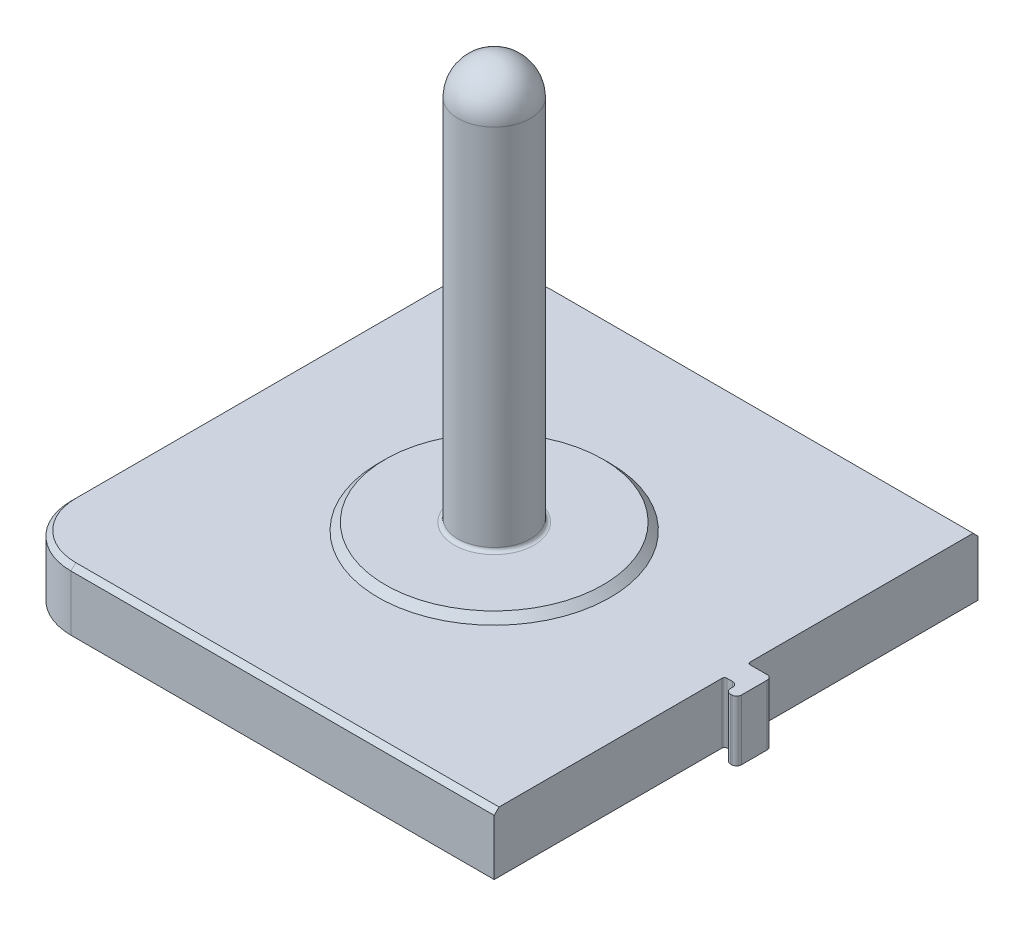
ISO-10303-21;
HEADER;
FILE_DESCRIPTION(('STEP AP214'),'2;1');
FILE_NAME('part.step','',(''),(''),'','','');
FILE_SCHEMA(('AUTOMOTIVE_DESIGN { 1 0 10303 214 1 1 1 1 }'));
ENDSEC;
DATA;
#1=APPLICATION_CONTEXT('core data for automotive mechanical design processes');
#2=APPLICATION_PROTOCOL_DEFINITION('international standard','automotive_design',2000,#1);
#3=PRODUCT_CONTEXT('',#1,'mechanical');
#4=PRODUCT('Part','Part','',(#3));
#5=PRODUCT_RELATED_PRODUCT_CATEGORY('part','',(#4));
#6=PRODUCT_DEFINITION_FORMATION('','',#4);
#7=PRODUCT_DEFINITION_CONTEXT('part definition',#1,'design');
#8=PRODUCT_DEFINITION('design','',#6,#7);
#9=PRODUCT_DEFINITION_SHAPE('','',#8);
#10=(LENGTH_UNIT() NAMED_UNIT(*) SI_UNIT(.MILLI.,.METRE.));
#11=(NAMED_UNIT(*) PLANE_ANGLE_UNIT() SI_UNIT($,.RADIAN.));
#12=(NAMED_UNIT(*) SI_UNIT($,.STERADIAN.) SOLID_ANGLE_UNIT());
#13=UNCERTAINTY_MEASURE_WITH_UNIT(LENGTH_MEASURE(1.E-05),#10,'distance_accuracy_value','');
#14=(GEOMETRIC_REPRESENTATION_CONTEXT(3) GLOBAL_UNCERTAINTY_ASSIGNED_CONTEXT((#13)) GLOBAL_UNIT_ASSIGNED_CONTEXT((#10,
#11,#12)) REPRESENTATION_CONTEXT('',''));
#15=CARTESIAN_POINT('',(0.,0.,0.));
#16=DIRECTION('',(0.,0.,1.));
#17=DIRECTION('',(1.,0.,0.));
#18=AXIS2_PLACEMENT_3D('',#15,#16,#17);
#19=CARTESIAN_POINT('',(100.,25.,99.9999999999999));
#20=DIRECTION('',(-1.,0.,0.));
#21=DIRECTION('',(0.,0.,1.));
#22=AXIS2_PLACEMENT_3D('',#19,#20,#21);
#23=PLANE('',#22);
#24=DIRECTION('',(0.,0.,-1.));
#25=VECTOR('',#24,1.);
#26=CARTESIAN_POINT('',(100.,25.,99.9999999999999));
#27=LINE('',#26,#25);
#28=CARTESIAN_POINT('',(100.,25.,98.));
#29=VERTEX_POINT('',#28);
#30=CARTESIAN_POINT('',(100.,25.,5.80000000000003));
#31=VERTEX_POINT('',#30);
#32=EDGE_CURVE('E260',#29,#31,#27,.T.);
#33=ORIENTED_EDGE('',*,*,#32,.F.);
#34=DIRECTION('',(0.,-0.707106781186551,0.707106781186544));
#35=VECTOR('',#34,1.);
#36=CARTESIAN_POINT('',(100.,25.,98.));
#37=LINE('',#36,#35);
#38=CARTESIAN_POINT('',(100.,23.,99.9999999999999));
#39=VERTEX_POINT('',#38);
#40=EDGE_CURVE('E45',#29,#39,#37,.T.);
#41=ORIENTED_EDGE('',*,*,#40,.T.);
#42=DIRECTION('',(0.,-1.,0.));
#43=VECTOR('',#42,1.);
#44=CARTESIAN_POINT('',(100.,25.,99.9999999999999));
#45=LINE('',#44,#43);
#46=CARTESIAN_POINT('',(100.,0.,99.9999999999999));
#47=VERTEX_POINT('',#46);
#48=EDGE_CURVE('E277',#39,#47,#45,.T.);
#49=ORIENTED_EDGE('',*,*,#48,.T.);
#50=DIRECTION('',(0.,0.,-1.));
#51=VECTOR('',#50,1.);
#52=CARTESIAN_POINT('',(100.,0.,99.9999999999999));
#53=LINE('',#52,#51);
#54=CARTESIAN_POINT('',(100.,0.,5.80000000000003));
#55=VERTEX_POINT('',#54);
#56=EDGE_CURVE('E270',#47,#55,#53,.T.);
#57=ORIENTED_EDGE('',*,*,#56,.T.);
#58=DIRECTION('',(0.,-1.,0.));
#59=VECTOR('',#58,1.);
#60=CARTESIAN_POINT('',(100.,25.,5.8));
#61=LINE('',#60,#59);
#62=EDGE_CURVE('E286',#55,#31,#61,.F.);
#63=ORIENTED_EDGE('',*,*,#62,.T.);
#64=EDGE_LOOP('',(#33,#41,#49,#57,#63));
#65=FACE_BOUND('',#64,.T.);
#66=ADVANCED_FACE('F35',(#65),#23,.F.);
#67=CARTESIAN_POINT('',(-100.,25.,100.));
#68=DIRECTION('',(1.,0.,0.));
#69=DIRECTION('',(0.,0.,-1.));
#70=AXIS2_PLACEMENT_3D('',#67,#68,#69);
#71=PLANE('',#70);
#72=DIRECTION('',(0.,-1.,0.));
#73=VECTOR('',#72,1.);
#74=CARTESIAN_POINT('',(-100.,25.,75.));
#75=LINE('',#74,#73);
#76=CARTESIAN_POINT('',(-100.,0.,75.));
#77=VERTEX_POINT('',#76);
#78=CARTESIAN_POINT('',(-100.,23.,75.));
#79=VERTEX_POINT('',#78);
#80=EDGE_CURVE('E296',#77,#79,#75,.F.);
#81=ORIENTED_EDGE('',*,*,#80,.T.);
#82=DIRECTION('',(0.,0.,-1.));
#83=VECTOR('',#82,1.);
#84=CARTESIAN_POINT('',(-100.,23.,-75.));
#85=LINE('',#84,#83);
#86=CARTESIAN_POINT('',(-100.,23.,-75.));
#87=VERTEX_POINT('',#86);
#88=EDGE_CURVE('E339',#79,#87,#85,.T.);
#89=ORIENTED_EDGE('',*,*,#88,.T.);
#90=DIRECTION('',(0.,-1.,0.));
#91=VECTOR('',#90,1.);
#92=CARTESIAN_POINT('',(-100.,25.,-75.));
#93=LINE('',#92,#91);
#94=CARTESIAN_POINT('',(-100.,0.,-75.));
#95=VERTEX_POINT('',#94);
#96=EDGE_CURVE('E299',#87,#95,#93,.T.);
#97=ORIENTED_EDGE('',*,*,#96,.T.);
#98=DIRECTION('',(0.,0.,1.));
#99=VECTOR('',#98,1.);
#100=CARTESIAN_POINT('',(-100.,0.,100.));
#101=LINE('',#100,#99);
#102=EDGE_CURVE('E199',#95,#77,#101,.T.);
#103=ORIENTED_EDGE('',*,*,#102,.T.);
#104=EDGE_LOOP('',(#81,#89,#97,#103));
#105=FACE_BOUND('',#104,.T.);
#106=ADVANCED_FACE('F383',(#105),#71,.F.);
#107=CARTESIAN_POINT('',(100.,25.,99.9999999999999));
#108=DIRECTION('',(0.,0.,-1.));
#109=DIRECTION('',(-1.,0.,0.));
#110=AXIS2_PLACEMENT_3D('',#107,#108,#109);
#111=PLANE('',#110);
#112=ORIENTED_EDGE('',*,*,#48,.F.);
#113=DIRECTION('',(-1.,0.,0.));
#114=VECTOR('',#113,1.);
#115=CARTESIAN_POINT('',(-75.,23.,100.));
#116=LINE('',#115,#114);
#117=CARTESIAN_POINT('',(-75.,23.,100.));
#118=VERTEX_POINT('',#117);
#119=EDGE_CURVE('E11',#39,#118,#116,.T.);
#120=ORIENTED_EDGE('',*,*,#119,.T.);
#121=DIRECTION('',(0.,-1.,0.));
#122=VECTOR('',#121,1.);
#123=CARTESIAN_POINT('',(-75.,25.,100.));
#124=LINE('',#123,#122);
#125=CARTESIAN_POINT('',(-75.,0.,100.));
#126=VERTEX_POINT('',#125);
#127=EDGE_CURVE('E308',#118,#126,#124,.T.);
#128=ORIENTED_EDGE('',*,*,#127,.T.);
#129=DIRECTION('',(1.,0.,0.));
#130=VECTOR('',#129,1.);
#131=CARTESIAN_POINT('',(100.,0.,99.9999999999999));
#132=LINE('',#131,#130);
#133=EDGE_CURVE('E266',#126,#47,#132,.T.);
#134=ORIENTED_EDGE('',*,*,#133,.T.);
#135=EDGE_LOOP('',(#112,#120,#128,#134));
#136=FACE_BOUND('',#135,.T.);
#137=ADVANCED_FACE('F389',(#136),#111,.F.);
#138=DIRECTION('',(0.,-1.,0.));
#139=VECTOR('',#138,1.);
#140=CARTESIAN_POINT('',(100.,25.,-100.));
#141=LINE('',#140,#139);
#142=CARTESIAN_POINT('',(100.,23.,-100.));
#143=VERTEX_POINT('',#142);
#144=CARTESIAN_POINT('',(100.,0.,-100.));
#145=VERTEX_POINT('',#144);
#146=EDGE_CURVE('E262',#143,#145,#141,.T.);
#147=ORIENTED_EDGE('',*,*,#146,.F.);
#148=DIRECTION('',(0.,0.707106781186554,0.707106781186541));
#149=VECTOR('',#148,1.);
#150=CARTESIAN_POINT('',(100.,25.,-98.0000000000001));
#151=LINE('',#150,#149);
#152=CARTESIAN_POINT('',(100.,25.,-98.));
#153=VERTEX_POINT('',#152);
#154=EDGE_CURVE('E335',#143,#153,#151,.T.);
#155=ORIENTED_EDGE('',*,*,#154,.T.);
#156=CARTESIAN_POINT('',(100.,25.,-5.79999999999997));
#157=VERTEX_POINT('',#156);
#158=EDGE_CURVE('E263',#157,#153,#27,.T.);
#159=ORIENTED_EDGE('',*,*,#158,.F.);
#160=DIRECTION('',(0.,-1.,0.));
#161=VECTOR('',#160,1.);
#162=CARTESIAN_POINT('',(100.,0.,-5.8));
#163=LINE('',#162,#161);
#164=CARTESIAN_POINT('',(100.,0.,-5.79999999999997));
#165=VERTEX_POINT('',#164);
#166=EDGE_CURVE('E279',#157,#165,#163,.T.);
#167=ORIENTED_EDGE('',*,*,#166,.T.);
#168=EDGE_CURVE('E269',#165,#145,#53,.T.);
#169=ORIENTED_EDGE('',*,*,#168,.T.);
#170=EDGE_LOOP('',(#147,#155,#159,#167,#169));
#171=FACE_BOUND('',#170,.T.);
#172=ADVANCED_FACE('F385',(#171),#23,.F.);
#173=CARTESIAN_POINT('',(100.,25.,-100.));
#174=DIRECTION('',(0.,0.,1.));
#175=DIRECTION('',(1.,0.,0.));
#176=AXIS2_PLACEMENT_3D('',#173,#174,#175);
#177=PLANE('',#176);
#178=DIRECTION('',(0.,-1.,0.));
#179=VECTOR('',#178,1.);
#180=CARTESIAN_POINT('',(-75.,25.,-100.));
#181=LINE('',#180,#179);
#182=CARTESIAN_POINT('',(-75.,0.,-100.));
#183=VERTEX_POINT('',#182);
#184=CARTESIAN_POINT('',(-75.,23.,-100.));
#185=VERTEX_POINT('',#184);
#186=EDGE_CURVE('E305',#183,#185,#181,.F.);
#187=ORIENTED_EDGE('',*,*,#186,.T.);
#188=DIRECTION('',(1.,0.,0.));
#189=VECTOR('',#188,1.);
#190=CARTESIAN_POINT('',(100.,23.,-100.));
#191=LINE('',#190,#189);
#192=EDGE_CURVE('E333',#185,#143,#191,.T.);
#193=ORIENTED_EDGE('',*,*,#192,.T.);
#194=ORIENTED_EDGE('',*,*,#146,.T.);
#195=DIRECTION('',(-1.,0.,0.));
#196=VECTOR('',#195,1.);
#197=CARTESIAN_POINT('',(100.,0.,-100.));
#198=LINE('',#197,#196);
#199=EDGE_CURVE('E273',#145,#183,#198,.T.);
#200=ORIENTED_EDGE('',*,*,#199,.T.);
#201=EDGE_LOOP('',(#187,#193,#194,#200));
#202=FACE_BOUND('',#201,.T.);
#203=ADVANCED_FACE('F395',(#202),#177,.F.);
#204=CARTESIAN_POINT('',(0.,25.,0.));
#205=DIRECTION('',(0.,1.,0.));
#206=DIRECTION('',(0.,0.,1.));
#207=AXIS2_PLACEMENT_3D('',#204,#205,#206);
#208=PLANE('',#207);
#209=CARTESIAN_POINT('',(0.,25.,0.));
#210=DIRECTION('',(0.,1.,0.));
#211=DIRECTION('',(0.,0.,1.));
#212=AXIS2_PLACEMENT_3D('',#209,#210,#211);
#213=CIRCLE('',#212,48.);
#214=CARTESIAN_POINT('',(0.,25.,-48.));
#215=VERTEX_POINT('',#214);
#216=EDGE_CURVE('E313',#215,#215,#213,.F.);
#217=ORIENTED_EDGE('',*,*,#216,.T.);
#218=EDGE_LOOP('',(#217));
#219=FACE_BOUND('',#218,.T.);
#220=ORIENTED_EDGE('',*,*,#158,.T.);
#221=DIRECTION('',(-1.,0.,0.));
#222=VECTOR('',#221,1.);
#223=CARTESIAN_POINT('',(-75.,25.,-98.0000000000001));
#224=LINE('',#223,#222);
#225=CARTESIAN_POINT('',(-75.,25.,-98.));
#226=VERTEX_POINT('',#225);
#227=EDGE_CURVE('E330',#153,#226,#224,.T.);
#228=ORIENTED_EDGE('',*,*,#227,.T.);
#229=CARTESIAN_POINT('',(-75.,25.,-75.));
#230=DIRECTION('',(0.,1.,0.));
#231=DIRECTION('',(0.,0.,1.));
#232=AXIS2_PLACEMENT_3D('',#229,#230,#231);
#233=CIRCLE('',#232,23.);
#234=CARTESIAN_POINT('',(-98.,25.,-75.));
#235=VERTEX_POINT('',#234);
#236=EDGE_CURVE('E328',#226,#235,#233,.T.);
#237=ORIENTED_EDGE('',*,*,#236,.T.);
#238=DIRECTION('',(0.,0.,1.));
#239=VECTOR('',#238,1.);
#240=CARTESIAN_POINT('',(-98.,25.,75.));
#241=LINE('',#240,#239);
#242=CARTESIAN_POINT('',(-98.,25.,75.));
#243=VERTEX_POINT('',#242);
#244=EDGE_CURVE('E326',#235,#243,#241,.T.);
#245=ORIENTED_EDGE('',*,*,#244,.T.);
#246=CARTESIAN_POINT('',(-75.,25.,75.));
#247=DIRECTION('',(0.,1.,0.));
#248=DIRECTION('',(0.,0.,1.));
#249=AXIS2_PLACEMENT_3D('',#246,#247,#248);
#250=CIRCLE('',#249,23.);
#251=CARTESIAN_POINT('',(-75.,25.,98.));
#252=VERTEX_POINT('',#251);
#253=EDGE_CURVE('E324',#243,#252,#250,.T.);
#254=ORIENTED_EDGE('',*,*,#253,.T.);
#255=DIRECTION('',(1.,0.,0.));
#256=VECTOR('',#255,1.);
#257=CARTESIAN_POINT('',(100.,25.,98.));
#258=LINE('',#257,#256);
#259=EDGE_CURVE('E322',#252,#29,#258,.T.);
#260=ORIENTED_EDGE('',*,*,#259,.T.);
#261=ORIENTED_EDGE('',*,*,#32,.T.);
#262=CARTESIAN_POINT('',(101.,25.,5.8));
#263=DIRECTION('',(0.,1.,0.));
#264=DIRECTION('',(0.,0.,1.));
#265=AXIS2_PLACEMENT_3D('',#262,#263,#264);
#266=CIRCLE('',#265,1.);
#267=CARTESIAN_POINT('',(101.,25.,4.8));
#268=VERTEX_POINT('',#267);
#269=EDGE_CURVE('E186',#31,#268,#266,.F.);
#270=ORIENTED_EDGE('',*,*,#269,.T.);
#271=DIRECTION('',(1.,0.,0.));
#272=VECTOR('',#271,1.);
#273=CARTESIAN_POINT('',(103.4,25.,4.8));
#274=LINE('',#273,#272);
#275=CARTESIAN_POINT('',(103.4,25.,4.8));
#276=VERTEX_POINT('',#275);
#277=EDGE_CURVE('E178',#268,#276,#274,.T.);
#278=ORIENTED_EDGE('',*,*,#277,.T.);
#279=CARTESIAN_POINT('',(103.4,25.,6.8));
#280=DIRECTION('',(0.,-1.,0.));
#281=DIRECTION('',(0.,0.,1.));
#282=AXIS2_PLACEMENT_3D('',#279,#280,#281);
#283=CIRCLE('',#282,2.);
#284=CARTESIAN_POINT('',(105.4,25.,6.8));
#285=VERTEX_POINT('',#284);
#286=EDGE_CURVE('E183',#276,#285,#283,.T.);
#287=ORIENTED_EDGE('',*,*,#286,.T.);
#288=DIRECTION('',(0.,0.,1.));
#289=VECTOR('',#288,1.);
#290=CARTESIAN_POINT('',(105.4,25.,7.8));
#291=LINE('',#290,#289);
#292=CARTESIAN_POINT('',(105.4,25.,7.8));
#293=VERTEX_POINT('',#292);
#294=EDGE_CURVE('E205',#285,#293,#291,.T.);
#295=ORIENTED_EDGE('',*,*,#294,.T.);
#296=CARTESIAN_POINT('',(107.4,25.,7.8));
#297=DIRECTION('',(0.,1.,0.));
#298=DIRECTION('',(0.,0.,-1.));
#299=AXIS2_PLACEMENT_3D('',#296,#297,#298);
#300=CIRCLE('',#299,2.);
#301=CARTESIAN_POINT('',(107.4,25.,9.8));
#302=VERTEX_POINT('',#301);
#303=EDGE_CURVE('E207',#293,#302,#300,.T.);
#304=ORIENTED_EDGE('',*,*,#303,.T.);
#305=DIRECTION('',(1.,0.,0.));
#306=VECTOR('',#305,1.);
#307=CARTESIAN_POINT('',(108.,25.,9.8));
#308=LINE('',#307,#306);
#309=CARTESIAN_POINT('',(108.,25.,9.8));
#310=VERTEX_POINT('',#309);
#311=EDGE_CURVE('E212',#302,#310,#308,.T.);
#312=ORIENTED_EDGE('',*,*,#311,.T.);
#313=CARTESIAN_POINT('',(108.,25.,7.8));
#314=DIRECTION('',(0.,1.,0.));
#315=DIRECTION('',(0.,0.,-1.));
#316=AXIS2_PLACEMENT_3D('',#313,#314,#315);
#317=CIRCLE('',#316,2.);
#318=CARTESIAN_POINT('',(110.,25.,7.8));
#319=VERTEX_POINT('',#318);
#320=EDGE_CURVE('E214',#310,#319,#317,.T.);
#321=ORIENTED_EDGE('',*,*,#320,.T.);
#322=DIRECTION('',(0.,0.,-1.));
#323=VECTOR('',#322,1.);
#324=CARTESIAN_POINT('',(110.,25.,-2.8));
#325=LINE('',#324,#323);
#326=CARTESIAN_POINT('',(110.,25.,-2.8));
#327=VERTEX_POINT('',#326);
#328=EDGE_CURVE('E216',#319,#327,#325,.T.);
#329=ORIENTED_EDGE('',*,*,#328,.T.);
#330=CARTESIAN_POINT('',(108.,25.,-2.8));
#331=DIRECTION('',(0.,1.,0.));
#332=DIRECTION('',(0.,0.,-1.));
#333=AXIS2_PLACEMENT_3D('',#330,#331,#332);
#334=CIRCLE('',#333,2.);
#335=CARTESIAN_POINT('',(108.,25.,-4.8));
#336=VERTEX_POINT('',#335);
#337=EDGE_CURVE('E218',#327,#336,#334,.T.);
#338=ORIENTED_EDGE('',*,*,#337,.T.);
#339=DIRECTION('',(-1.,0.,0.));
#340=VECTOR('',#339,1.);
#341=CARTESIAN_POINT('',(100.,25.,-4.8));
#342=LINE('',#341,#340);
#343=CARTESIAN_POINT('',(101.,25.,-4.8));
#344=VERTEX_POINT('',#343);
#345=EDGE_CURVE('E220',#336,#344,#342,.T.);
#346=ORIENTED_EDGE('',*,*,#345,.T.);
#347=CARTESIAN_POINT('',(101.,25.,-5.8));
#348=DIRECTION('',(0.,1.,0.));
#349=DIRECTION('',(0.,0.,1.));
#350=AXIS2_PLACEMENT_3D('',#347,#348,#349);
#351=CIRCLE('',#350,1.);
#352=EDGE_CURVE('E291',#344,#157,#351,.F.);
#353=ORIENTED_EDGE('',*,*,#352,.T.);
#354=EDGE_LOOP('',(#220,#228,#237,#245,#254,#260,#261,#270,#278,#287,#295,#304,#312,#321,#329,
#338,#346,#353));
#355=FACE_BOUND('',#354,.T.);
#356=ADVANCED_FACE('F181',(#219,#355),#208,.T.);
#357=CARTESIAN_POINT('',(0.,0.,0.));
#358=DIRECTION('',(0.,1.,0.));
#359=DIRECTION('',(0.,0.,1.));
#360=AXIS2_PLACEMENT_3D('',#357,#358,#359);
#361=PLANE('',#360);
#362=ORIENTED_EDGE('',*,*,#102,.F.);
#363=CARTESIAN_POINT('',(-75.,0.,-75.));
#364=DIRECTION('',(0.,1.,0.));
#365=DIRECTION('',(0.,0.,1.));
#366=AXIS2_PLACEMENT_3D('',#363,#364,#365);
#367=CIRCLE('',#366,25.);
#368=EDGE_CURVE('E303',#95,#183,#367,.F.);
#369=ORIENTED_EDGE('',*,*,#368,.T.);
#370=ORIENTED_EDGE('',*,*,#199,.F.);
#371=ORIENTED_EDGE('',*,*,#168,.F.);
#372=CARTESIAN_POINT('',(101.,0.,-5.8));
#373=DIRECTION('',(0.,1.,0.));
#374=DIRECTION('',(0.,0.,1.));
#375=AXIS2_PLACEMENT_3D('',#372,#373,#374);
#376=CIRCLE('',#375,1.);
#377=CARTESIAN_POINT('',(101.,0.,-4.8));
#378=VERTEX_POINT('',#377);
#379=EDGE_CURVE('E289',#165,#378,#376,.T.);
#380=ORIENTED_EDGE('',*,*,#379,.T.);
#381=DIRECTION('',(-1.,0.,0.));
#382=VECTOR('',#381,1.);
#383=CARTESIAN_POINT('',(100.,0.,-4.8));
#384=LINE('',#383,#382);
#385=CARTESIAN_POINT('',(108.,0.,-4.8));
#386=VERTEX_POINT('',#385);
#387=EDGE_CURVE('E190',#386,#378,#384,.T.);
#388=ORIENTED_EDGE('',*,*,#387,.F.);
#389=CARTESIAN_POINT('',(108.,0.,-2.8));
#390=DIRECTION('',(0.,1.,0.));
#391=DIRECTION('',(0.,0.,-1.));
#392=AXIS2_PLACEMENT_3D('',#389,#390,#391);
#393=CIRCLE('',#392,2.);
#394=CARTESIAN_POINT('',(110.,0.,-2.8));
#395=VERTEX_POINT('',#394);
#396=EDGE_CURVE('E238',#395,#386,#393,.T.);
#397=ORIENTED_EDGE('',*,*,#396,.F.);
#398=DIRECTION('',(0.,0.,-1.));
#399=VECTOR('',#398,1.);
#400=CARTESIAN_POINT('',(110.,0.,-2.8));
#401=LINE('',#400,#399);
#402=CARTESIAN_POINT('',(110.,0.,7.8));
#403=VERTEX_POINT('',#402);
#404=EDGE_CURVE('E236',#403,#395,#401,.T.);
#405=ORIENTED_EDGE('',*,*,#404,.F.);
#406=CARTESIAN_POINT('',(108.,0.,7.8));
#407=DIRECTION('',(0.,1.,0.));
#408=DIRECTION('',(0.,0.,-1.));
#409=AXIS2_PLACEMENT_3D('',#406,#407,#408);
#410=CIRCLE('',#409,2.);
#411=CARTESIAN_POINT('',(108.,0.,9.8));
#412=VERTEX_POINT('',#411);
#413=EDGE_CURVE('E234',#412,#403,#410,.T.);
#414=ORIENTED_EDGE('',*,*,#413,.F.);
#415=DIRECTION('',(1.,0.,0.));
#416=VECTOR('',#415,1.);
#417=CARTESIAN_POINT('',(108.,0.,9.8));
#418=LINE('',#417,#416);
#419=CARTESIAN_POINT('',(107.4,0.,9.8));
#420=VERTEX_POINT('',#419);
#421=EDGE_CURVE('E232',#420,#412,#418,.T.);
#422=ORIENTED_EDGE('',*,*,#421,.F.);
#423=CARTESIAN_POINT('',(107.4,0.,7.8));
#424=DIRECTION('',(0.,1.,0.));
#425=DIRECTION('',(0.,0.,-1.));
#426=AXIS2_PLACEMENT_3D('',#423,#424,#425);
#427=CIRCLE('',#426,2.);
#428=CARTESIAN_POINT('',(105.4,0.,7.8));
#429=VERTEX_POINT('',#428);
#430=EDGE_CURVE('E230',#429,#420,#427,.T.);
#431=ORIENTED_EDGE('',*,*,#430,.F.);
#432=DIRECTION('',(0.,0.,1.));
#433=VECTOR('',#432,1.);
#434=CARTESIAN_POINT('',(105.4,0.,7.8));
#435=LINE('',#434,#433);
#436=CARTESIAN_POINT('',(105.4,0.,6.8));
#437=VERTEX_POINT('',#436);
#438=EDGE_CURVE('E228',#437,#429,#435,.T.);
#439=ORIENTED_EDGE('',*,*,#438,.F.);
#440=CARTESIAN_POINT('',(103.4,0.,6.8));
#441=DIRECTION('',(0.,-1.,0.));
#442=DIRECTION('',(0.,0.,1.));
#443=AXIS2_PLACEMENT_3D('',#440,#441,#442);
#444=CIRCLE('',#443,2.);
#445=CARTESIAN_POINT('',(103.4,0.,4.8));
#446=VERTEX_POINT('',#445);
#447=EDGE_CURVE('E225',#446,#437,#444,.T.);
#448=ORIENTED_EDGE('',*,*,#447,.F.);
#449=DIRECTION('',(1.,0.,0.));
#450=VECTOR('',#449,1.);
#451=CARTESIAN_POINT('',(103.4,0.,4.8));
#452=LINE('',#451,#450);
#453=CARTESIAN_POINT('',(101.,0.,4.8));
#454=VERTEX_POINT('',#453);
#455=EDGE_CURVE('E196',#454,#446,#452,.T.);
#456=ORIENTED_EDGE('',*,*,#455,.F.);
#457=CARTESIAN_POINT('',(101.,0.,5.8));
#458=DIRECTION('',(0.,1.,0.));
#459=DIRECTION('',(0.,0.,1.));
#460=AXIS2_PLACEMENT_3D('',#457,#458,#459);
#461=CIRCLE('',#460,1.);
#462=EDGE_CURVE('E293',#454,#55,#461,.T.);
#463=ORIENTED_EDGE('',*,*,#462,.T.);
#464=ORIENTED_EDGE('',*,*,#56,.F.);
#465=ORIENTED_EDGE('',*,*,#133,.F.);
#466=CARTESIAN_POINT('',(-75.,0.,75.));
#467=DIRECTION('',(0.,1.,0.));
#468=DIRECTION('',(0.,0.,1.));
#469=AXIS2_PLACEMENT_3D('',#466,#467,#468);
#470=CIRCLE('',#469,25.);
#471=EDGE_CURVE('E301',#126,#77,#470,.F.);
#472=ORIENTED_EDGE('',*,*,#471,.T.);
#473=EDGE_LOOP('',(#362,#369,#370,#371,#380,#388,#397,#405,#414,#422,#431,#439,#448,#456,#463,
#464,#465,#472));
#474=FACE_BOUND('',#473,.T.);
#475=ADVANCED_FACE('F422',(#474),#361,.F.);
#476=CARTESIAN_POINT('',(103.4,25.,4.8));
#477=DIRECTION('',(0.,0.,-1.));
#478=DIRECTION('',(-1.,0.,0.));
#479=AXIS2_PLACEMENT_3D('',#476,#477,#478);
#480=PLANE('',#479);
#481=ORIENTED_EDGE('',*,*,#277,.F.);
#482=DIRECTION('',(0.,-1.,0.));
#483=VECTOR('',#482,1.);
#484=CARTESIAN_POINT('',(101.,0.,4.8));
#485=LINE('',#484,#483);
#486=EDGE_CURVE('E284',#268,#454,#485,.T.);
#487=ORIENTED_EDGE('',*,*,#486,.T.);
#488=ORIENTED_EDGE('',*,*,#455,.T.);
#489=DIRECTION('',(0.,-1.,0.));
#490=VECTOR('',#489,1.);
#491=CARTESIAN_POINT('',(103.4,25.,4.8));
#492=LINE('',#491,#490);
#493=EDGE_CURVE('E193',#276,#446,#492,.T.);
#494=ORIENTED_EDGE('',*,*,#493,.F.);
#495=EDGE_LOOP('',(#481,#487,#488,#494));
#496=FACE_BOUND('',#495,.T.);
#497=ADVANCED_FACE('F194',(#496),#480,.F.);
#498=CARTESIAN_POINT('',(103.4,25.,6.8));
#499=DIRECTION('',(0.,-1.,0.));
#500=DIRECTION('',(0.,0.,-1.));
#501=AXIS2_PLACEMENT_3D('',#498,#499,#500);
#502=CYLINDRICAL_SURFACE('',#501,2.);
#503=ORIENTED_EDGE('',*,*,#447,.T.);
#504=DIRECTION('',(0.,-1.,0.));
#505=VECTOR('',#504,1.);
#506=CARTESIAN_POINT('',(105.4,25.,6.8));
#507=LINE('',#506,#505);
#508=EDGE_CURVE('E200',#285,#437,#507,.T.);
#509=ORIENTED_EDGE('',*,*,#508,.F.);
#510=ORIENTED_EDGE('',*,*,#286,.F.);
#511=ORIENTED_EDGE('',*,*,#493,.T.);
#512=EDGE_LOOP('',(#503,#509,#510,#511));
#513=FACE_BOUND('',#512,.T.);
#514=ADVANCED_FACE('F202',(#513),#502,.F.);
#515=CARTESIAN_POINT('',(105.4,25.,7.8));
#516=DIRECTION('',(1.,0.,0.));
#517=DIRECTION('',(0.,0.,-1.));
#518=AXIS2_PLACEMENT_3D('',#515,#516,#517);
#519=PLANE('',#518);
#520=ORIENTED_EDGE('',*,*,#438,.T.);
#521=DIRECTION('',(0.,-1.,0.));
#522=VECTOR('',#521,1.);
#523=CARTESIAN_POINT('',(105.4,25.,7.8));
#524=LINE('',#523,#522);
#525=EDGE_CURVE('E256',#293,#429,#524,.T.);
#526=ORIENTED_EDGE('',*,*,#525,.F.);
#527=ORIENTED_EDGE('',*,*,#294,.F.);
#528=ORIENTED_EDGE('',*,*,#508,.T.);
#529=EDGE_LOOP('',(#520,#526,#527,#528));
#530=FACE_BOUND('',#529,.T.);
#531=ADVANCED_FACE('F454',(#530),#519,.F.);
#532=CARTESIAN_POINT('',(107.4,25.,7.8));
#533=DIRECTION('',(0.,-1.,0.));
#534=DIRECTION('',(0.,0.,-1.));
#535=AXIS2_PLACEMENT_3D('',#532,#533,#534);
#536=CYLINDRICAL_SURFACE('',#535,2.);
#537=ORIENTED_EDGE('',*,*,#430,.T.);
#538=DIRECTION('',(0.,-1.,0.));
#539=VECTOR('',#538,1.);
#540=CARTESIAN_POINT('',(107.4,25.,9.8));
#541=LINE('',#540,#539);
#542=EDGE_CURVE('E253',#302,#420,#541,.T.);
#543=ORIENTED_EDGE('',*,*,#542,.F.);
#544=ORIENTED_EDGE('',*,*,#303,.F.);
#545=ORIENTED_EDGE('',*,*,#525,.T.);
#546=EDGE_LOOP('',(#537,#543,#544,#545));
#547=FACE_BOUND('',#546,.T.);
#548=ADVANCED_FACE('F450',(#547),#536,.T.);
#549=CARTESIAN_POINT('',(108.,25.,9.8));
#550=DIRECTION('',(0.,0.,-1.));
#551=DIRECTION('',(-1.,0.,0.));
#552=AXIS2_PLACEMENT_3D('',#549,#550,#551);
#553=PLANE('',#552);
#554=ORIENTED_EDGE('',*,*,#421,.T.);
#555=DIRECTION('',(0.,-1.,0.));
#556=VECTOR('',#555,1.);
#557=CARTESIAN_POINT('',(108.,25.,9.8));
#558=LINE('',#557,#556);
#559=EDGE_CURVE('E250',#310,#412,#558,.T.);
#560=ORIENTED_EDGE('',*,*,#559,.F.);
#561=ORIENTED_EDGE('',*,*,#311,.F.);
#562=ORIENTED_EDGE('',*,*,#542,.T.);
#563=EDGE_LOOP('',(#554,#560,#561,#562));
#564=FACE_BOUND('',#563,.T.);
#565=ADVANCED_FACE('F445',(#564),#553,.F.);
#566=CARTESIAN_POINT('',(108.,25.,7.8));
#567=DIRECTION('',(0.,-1.,0.));
#568=DIRECTION('',(0.,0.,-1.));
#569=AXIS2_PLACEMENT_3D('',#566,#567,#568);
#570=CYLINDRICAL_SURFACE('',#569,2.);
#571=ORIENTED_EDGE('',*,*,#413,.T.);
#572=DIRECTION('',(0.,-1.,0.));
#573=VECTOR('',#572,1.);
#574=CARTESIAN_POINT('',(110.,25.,7.8));
#575=LINE('',#574,#573);
#576=EDGE_CURVE('E247',#319,#403,#575,.T.);
#577=ORIENTED_EDGE('',*,*,#576,.F.);
#578=ORIENTED_EDGE('',*,*,#320,.F.);
#579=ORIENTED_EDGE('',*,*,#559,.T.);
#580=EDGE_LOOP('',(#571,#577,#578,#579));
#581=FACE_BOUND('',#580,.T.);
#582=ADVANCED_FACE('F441',(#581),#570,.T.);
#583=CARTESIAN_POINT('',(110.,25.,-2.8));
#584=DIRECTION('',(-1.,0.,0.));
#585=DIRECTION('',(0.,0.,1.));
#586=AXIS2_PLACEMENT_3D('',#583,#584,#585);
#587=PLANE('',#586);
#588=ORIENTED_EDGE('',*,*,#404,.T.);
#589=DIRECTION('',(0.,-1.,0.));
#590=VECTOR('',#589,1.);
#591=CARTESIAN_POINT('',(110.,25.,-2.8));
#592=LINE('',#591,#590);
#593=EDGE_CURVE('E244',#327,#395,#592,.T.);
#594=ORIENTED_EDGE('',*,*,#593,.F.);
#595=ORIENTED_EDGE('',*,*,#328,.F.);
#596=ORIENTED_EDGE('',*,*,#576,.T.);
#597=EDGE_LOOP('',(#588,#594,#595,#596));
#598=FACE_BOUND('',#597,.T.);
#599=ADVANCED_FACE('F436',(#598),#587,.F.);
#600=CARTESIAN_POINT('',(108.,25.,-2.8));
#601=DIRECTION('',(0.,-1.,0.));
#602=DIRECTION('',(0.,0.,-1.));
#603=AXIS2_PLACEMENT_3D('',#600,#601,#602);
#604=CYLINDRICAL_SURFACE('',#603,2.);
#605=ORIENTED_EDGE('',*,*,#396,.T.);
#606=DIRECTION('',(0.,-1.,0.));
#607=VECTOR('',#606,1.);
#608=CARTESIAN_POINT('',(108.,25.,-4.8));
#609=LINE('',#608,#607);
#610=EDGE_CURVE('E223',#336,#386,#609,.T.);
#611=ORIENTED_EDGE('',*,*,#610,.F.);
#612=ORIENTED_EDGE('',*,*,#337,.F.);
#613=ORIENTED_EDGE('',*,*,#593,.T.);
#614=EDGE_LOOP('',(#605,#611,#612,#613));
#615=FACE_BOUND('',#614,.T.);
#616=ADVANCED_FACE('F430',(#615),#604,.T.);
#617=CARTESIAN_POINT('',(100.,25.,-4.8));
#618=DIRECTION('',(0.,0.,1.));
#619=DIRECTION('',(1.,0.,0.));
#620=AXIS2_PLACEMENT_3D('',#617,#618,#619);
#621=PLANE('',#620);
#622=ORIENTED_EDGE('',*,*,#387,.T.);
#623=DIRECTION('',(0.,-1.,0.));
#624=VECTOR('',#623,1.);
#625=CARTESIAN_POINT('',(101.,25.,-4.8));
#626=LINE('',#625,#624);
#627=EDGE_CURVE('E282',#378,#344,#626,.F.);
#628=ORIENTED_EDGE('',*,*,#627,.T.);
#629=ORIENTED_EDGE('',*,*,#345,.F.);
#630=ORIENTED_EDGE('',*,*,#610,.T.);
#631=EDGE_LOOP('',(#622,#628,#629,#630));
#632=FACE_BOUND('',#631,.T.);
#633=ADVANCED_FACE('F425',(#632),#621,.F.);
#634=CARTESIAN_POINT('',(101.,25.,-5.8));
#635=DIRECTION('',(0.,1.,0.));
#636=DIRECTION('',(0.,0.,1.));
#637=AXIS2_PLACEMENT_3D('',#634,#635,#636);
#638=CYLINDRICAL_SURFACE('',#637,1.);
#639=ORIENTED_EDGE('',*,*,#352,.F.);
#640=ORIENTED_EDGE('',*,*,#627,.F.);
#641=ORIENTED_EDGE('',*,*,#379,.F.);
#642=ORIENTED_EDGE('',*,*,#166,.F.);
#643=EDGE_LOOP('',(#639,#640,#641,#642));
#644=FACE_BOUND('',#643,.T.);
#645=ADVANCED_FACE('F417',(#644),#638,.F.);
#646=CARTESIAN_POINT('',(101.,25.,5.8));
#647=DIRECTION('',(0.,1.,0.));
#648=DIRECTION('',(0.,0.,1.));
#649=AXIS2_PLACEMENT_3D('',#646,#647,#648);
#650=CYLINDRICAL_SURFACE('',#649,1.);
#651=ORIENTED_EDGE('',*,*,#269,.F.);
#652=ORIENTED_EDGE('',*,*,#62,.F.);
#653=ORIENTED_EDGE('',*,*,#462,.F.);
#654=ORIENTED_EDGE('',*,*,#486,.F.);
#655=EDGE_LOOP('',(#651,#652,#653,#654));
#656=FACE_BOUND('',#655,.T.);
#657=ADVANCED_FACE('F540',(#656),#650,.F.);
#658=CARTESIAN_POINT('',(-75.,25.,-75.));
#659=DIRECTION('',(0.,-1.,0.));
#660=DIRECTION('',(0.,0.,-1.));
#661=AXIS2_PLACEMENT_3D('',#658,#659,#660);
#662=CYLINDRICAL_SURFACE('',#661,25.);
#663=ORIENTED_EDGE('',*,*,#96,.F.);
#664=CARTESIAN_POINT('',(-75.,23.,-75.));
#665=DIRECTION('',(0.,1.,0.));
#666=DIRECTION('',(0.,0.,1.));
#667=AXIS2_PLACEMENT_3D('',#664,#665,#666);
#668=CIRCLE('',#667,25.);
#669=EDGE_CURVE('E337',#87,#185,#668,.F.);
#670=ORIENTED_EDGE('',*,*,#669,.T.);
#671=ORIENTED_EDGE('',*,*,#186,.F.);
#672=ORIENTED_EDGE('',*,*,#368,.F.);
#673=EDGE_LOOP('',(#663,#670,#671,#672));
#674=FACE_BOUND('',#673,.T.);
#675=ADVANCED_FACE('F546',(#674),#662,.T.);
#676=CARTESIAN_POINT('',(-75.,25.,75.));
#677=DIRECTION('',(0.,-1.,0.));
#678=DIRECTION('',(0.,0.,-1.));
#679=AXIS2_PLACEMENT_3D('',#676,#677,#678);
#680=CYLINDRICAL_SURFACE('',#679,25.);
#681=ORIENTED_EDGE('',*,*,#127,.F.);
#682=CARTESIAN_POINT('',(-75.,23.,75.));
#683=DIRECTION('',(0.,1.,0.));
#684=DIRECTION('',(0.,0.,1.));
#685=AXIS2_PLACEMENT_3D('',#682,#683,#684);
#686=CIRCLE('',#685,25.);
#687=EDGE_CURVE('E341',#118,#79,#686,.F.);
#688=ORIENTED_EDGE('',*,*,#687,.T.);
#689=ORIENTED_EDGE('',*,*,#80,.F.);
#690=ORIENTED_EDGE('',*,*,#471,.F.);
#691=EDGE_LOOP('',(#681,#688,#689,#690));
#692=FACE_BOUND('',#691,.T.);
#693=ADVANCED_FACE('F554',(#692),#680,.T.);
#694=CARTESIAN_POINT('',(0.,28.,0.));
#695=DIRECTION('',(0.,1.,0.));
#696=DIRECTION('',(0.,0.,1.));
#697=AXIS2_PLACEMENT_3D('',#694,#695,#696);
#698=PLANE('',#697);
#699=CARTESIAN_POINT('',(0.,28.,0.));
#700=DIRECTION('',(0.,1.,0.));
#701=DIRECTION('',(0.,0.,1.));
#702=AXIS2_PLACEMENT_3D('',#699,#700,#701);
#703=CIRCLE('',#702,16.5);
#704=CARTESIAN_POINT('',(0.,28.,16.5));
#705=VERTEX_POINT('',#704);
#706=EDGE_CURVE('E319',#705,#705,#703,.F.);
#707=ORIENTED_EDGE('',*,*,#706,.T.);
#708=EDGE_LOOP('',(#707));
#709=FACE_BOUND('',#708,.T.);
#710=CARTESIAN_POINT('',(0.,28.,0.));
#711=DIRECTION('',(0.,1.,0.));
#712=DIRECTION('',(0.,0.,1.));
#713=AXIS2_PLACEMENT_3D('',#710,#711,#712);
#714=CIRCLE('',#713,45.);
#715=CARTESIAN_POINT('',(0.,28.,-45.));
#716=VERTEX_POINT('',#715);
#717=EDGE_CURVE('E226',#716,#716,#714,.T.);
#718=ORIENTED_EDGE('',*,*,#717,.T.);
#719=EDGE_LOOP('',(#718));
#720=FACE_BOUND('',#719,.T.);
#721=ADVANCED_FACE('F362',(#709,#720),#698,.T.);
#722=CARTESIAN_POINT('',(0.,180.,0.));
#723=DIRECTION('',(0.,1.,0.));
#724=DIRECTION('',(0.,0.,1.));
#725=AXIS2_PLACEMENT_3D('',#722,#723,#724);
#726=SPHERICAL_SURFACE('',#725,15.);
#727=CARTESIAN_POINT('',(0.,180.,0.));
#728=DIRECTION('',(0.,-1.,0.));
#729=DIRECTION('',(0.,0.,-1.));
#730=AXIS2_PLACEMENT_3D('',#727,#728,#729);
#731=CIRCLE('',#730,15.);
#732=CARTESIAN_POINT('',(0.,180.,-15.));
#733=VERTEX_POINT('',#732);
#734=EDGE_CURVE('E310',#733,#733,#731,.T.);
#735=ORIENTED_EDGE('',*,*,#734,.F.);
#736=EDGE_LOOP('',(#735));
#737=FACE_BOUND('',#736,.T.);
#738=ADVANCED_FACE('F376',(#737),#726,.T.);
#739=CARTESIAN_POINT('',(0.,195.,0.));
#740=DIRECTION('',(0.,-1.,0.));
#741=DIRECTION('',(0.,0.,-1.));
#742=AXIS2_PLACEMENT_3D('',#739,#740,#741);
#743=CYLINDRICAL_SURFACE('',#742,15.);
#744=CARTESIAN_POINT('',(0.,29.5,0.));
#745=DIRECTION('',(0.,1.,0.));
#746=DIRECTION('',(0.,0.,1.));
#747=AXIS2_PLACEMENT_3D('',#744,#745,#746);
#748=CIRCLE('',#747,15.);
#749=CARTESIAN_POINT('',(0.,29.5,15.));
#750=VERTEX_POINT('',#749);
#751=EDGE_CURVE('E316',#750,#750,#748,.T.);
#752=ORIENTED_EDGE('',*,*,#751,.T.);
#753=EDGE_LOOP('',(#752));
#754=FACE_BOUND('',#753,.T.);
#755=ORIENTED_EDGE('',*,*,#734,.T.);
#756=EDGE_LOOP('',(#755));
#757=FACE_BOUND('',#756,.T.);
#758=ADVANCED_FACE('F367',(#754,#757),#743,.T.);
#759=CARTESIAN_POINT('',(0.,28.,0.));
#760=DIRECTION('',(0.,-1.,0.));
#761=DIRECTION('',(0.,0.,-1.));
#762=AXIS2_PLACEMENT_3D('',#759,#760,#761);
#763=CONICAL_SURFACE('',#762,45.,0.785398163397446);
#764=CARTESIAN_POINT('',(0.,25.,-48.));
#765=CARTESIAN_POINT('',(0.,25.03125,-47.96875));
#766=CARTESIAN_POINT('',(0.,25.0625,-47.9375));
#767=CARTESIAN_POINT('',(0.,25.125,-47.875));
#768=CARTESIAN_POINT('',(0.,25.15625,-47.84375));
#769=CARTESIAN_POINT('',(0.,25.21875,-47.78125));
#770=CARTESIAN_POINT('',(0.,25.25,-47.75));
#771=CARTESIAN_POINT('',(0.,25.3125,-47.6875));
#772=CARTESIAN_POINT('',(0.,25.34375,-47.65625));
#773=CARTESIAN_POINT('',(0.,25.40625,-47.59375));
#774=CARTESIAN_POINT('',(0.,25.4375,-47.5625));
#775=CARTESIAN_POINT('',(0.,25.5,-47.5));
#776=CARTESIAN_POINT('',(0.,25.53125,-47.46875));
#777=CARTESIAN_POINT('',(0.,25.59375,-47.40625));
#778=CARTESIAN_POINT('',(0.,25.625,-47.375));
#779=CARTESIAN_POINT('',(0.,25.6875,-47.3125));
#780=CARTESIAN_POINT('',(0.,25.71875,-47.28125));
#781=CARTESIAN_POINT('',(0.,25.78125,-47.21875));
#782=CARTESIAN_POINT('',(0.,25.8125,-47.1875));
#783=CARTESIAN_POINT('',(0.,25.875,-47.125));
#784=CARTESIAN_POINT('',(0.,25.90625,-47.09375));
#785=CARTESIAN_POINT('',(0.,25.96875,-47.03125));
#786=CARTESIAN_POINT('',(0.,26.,-47.));
#787=CARTESIAN_POINT('',(0.,26.0625,-46.9375));
#788=CARTESIAN_POINT('',(0.,26.09375,-46.90625));
#789=CARTESIAN_POINT('',(0.,26.15625,-46.84375));
#790=CARTESIAN_POINT('',(0.,26.1875,-46.8125));
#791=CARTESIAN_POINT('',(0.,26.25,-46.75));
#792=CARTESIAN_POINT('',(0.,26.28125,-46.71875));
#793=CARTESIAN_POINT('',(0.,26.34375,-46.65625));
#794=CARTESIAN_POINT('',(0.,26.375,-46.625));
#795=CARTESIAN_POINT('',(0.,26.4375,-46.5625));
#796=CARTESIAN_POINT('',(0.,26.46875,-46.53125));
#797=CARTESIAN_POINT('',(0.,26.53125,-46.46875));
#798=CARTESIAN_POINT('',(0.,26.5625,-46.4375));
#799=CARTESIAN_POINT('',(0.,26.625,-46.375));
#800=CARTESIAN_POINT('',(0.,26.65625,-46.34375));
#801=CARTESIAN_POINT('',(0.,26.71875,-46.28125));
#802=CARTESIAN_POINT('',(0.,26.75,-46.25));
#803=CARTESIAN_POINT('',(0.,26.8125,-46.1875));
#804=CARTESIAN_POINT('',(0.,26.84375,-46.15625));
#805=CARTESIAN_POINT('',(0.,26.90625,-46.09375));
#806=CARTESIAN_POINT('',(0.,26.9375,-46.0625));
#807=CARTESIAN_POINT('',(0.,27.,-46.));
#808=CARTESIAN_POINT('',(0.,27.03125,-45.96875));
#809=CARTESIAN_POINT('',(0.,27.09375,-45.90625));
#810=CARTESIAN_POINT('',(0.,27.125,-45.875));
#811=CARTESIAN_POINT('',(0.,27.1875,-45.8125));
#812=CARTESIAN_POINT('',(0.,27.21875,-45.78125));
#813=CARTESIAN_POINT('',(0.,27.28125,-45.71875));
#814=CARTESIAN_POINT('',(0.,27.3125,-45.6875));
#815=CARTESIAN_POINT('',(0.,27.375,-45.625));
#816=CARTESIAN_POINT('',(0.,27.40625,-45.59375));
#817=CARTESIAN_POINT('',(0.,27.46875,-45.53125));
#818=CARTESIAN_POINT('',(0.,27.5,-45.5));
#819=CARTESIAN_POINT('',(0.,27.5625,-45.4375));
#820=CARTESIAN_POINT('',(0.,27.59375,-45.40625));
#821=CARTESIAN_POINT('',(0.,27.65625,-45.34375));
#822=CARTESIAN_POINT('',(0.,27.6875,-45.3125));
#823=CARTESIAN_POINT('',(0.,27.75,-45.25));
#824=CARTESIAN_POINT('',(0.,27.78125,-45.21875));
#825=CARTESIAN_POINT('',(0.,27.84375,-45.15625));
#826=CARTESIAN_POINT('',(0.,27.875,-45.125));
#827=CARTESIAN_POINT('',(0.,27.9375,-45.0625));
#828=CARTESIAN_POINT('',(0.,27.96875,-45.03125));
#829=CARTESIAN_POINT('',(0.,28.,-45.));
#830=B_SPLINE_CURVE_WITH_KNOTS('',3,(#764,#765,#766,#767,#768,#769,#770,#771,#772,#773,#774,
#775,#776,#777,#778,#779,#780,#781,#782,#783,#784,#785,#786,#787,#788,#789,#790,#791,#792,#793,
#794,#795,#796,#797,#798,#799,#800,#801,#802,#803,#804,#805,#806,#807,#808,#809,#810,#811,#812,
#813,#814,#815,#816,#817,#818,#819,#820,#821,#822,#823,#824,#825,#826,#827,#828,#829),
.UNSPECIFIED.,.F.,.F.,(4,2,2,2,2,2,2,2,2,2,2,2,2,2,2,2,2,2,2,2,2,2,2,2,2,2,2,2,2,2,2,2,4),(0.,
0.132582521472475,0.265165042944951,0.397747564417431,0.530330085889906,0.662912607362386,
0.795495128834862,0.928077650307342,1.06066017177982,1.19324269325229,1.32582521472477,
1.45840773619725,1.59099025766973,1.7235727791422,1.85615530061468,1.98873782208716,
2.12132034355963,2.25390286503211,2.38648538650459,2.51906790797707,2.65165042944955,
2.78423295092203,2.9168154723945,3.04939799386698,3.18198051533946,3.31456303681193,
3.44714555828441,3.57972807975689,3.71231060122937,3.84489312270184,3.97747564417432,
4.1100581656468,4.24264068711928),.UNSPECIFIED.);
#831=EDGE_CURVE('BSEAM364',#215,#716,#830,.T.);
#832=ORIENTED_EDGE('',*,*,#216,.F.);
#833=ORIENTED_EDGE('',*,*,#717,.F.);
#834=ORIENTED_EDGE('',*,*,#831,.T.);
#835=ORIENTED_EDGE('',*,*,#831,.F.);
#836=EDGE_LOOP('',(#832,#834,#833,#835));
#837=FACE_BOUND('',#836,.T.);
#838=ADVANCED_FACE('F364',(#837),#763,.T.);
#839=CARTESIAN_POINT('',(0.,29.5,0.));
#840=DIRECTION('',(0.,1.,0.));
#841=DIRECTION('',(0.,0.,1.));
#842=AXIS2_PLACEMENT_3D('',#839,#840,#841);
#843=TOROIDAL_SURFACE('',#842,16.5,1.5);
#844=ORIENTED_EDGE('',*,*,#706,.F.);
#845=EDGE_LOOP('',(#844));
#846=FACE_BOUND('',#845,.T.);
#847=ORIENTED_EDGE('',*,*,#751,.F.);
#848=EDGE_LOOP('',(#847));
#849=FACE_BOUND('',#848,.T.);
#850=ADVANCED_FACE('F366',(#846,#849),#843,.F.);
#851=CARTESIAN_POINT('',(0.,25.,98.));
#852=DIRECTION('',(0.,0.707106781186544,0.707106781186551));
#853=DIRECTION('',(-1.,0.,0.));
#854=AXIS2_PLACEMENT_3D('',#851,#852,#853);
#855=PLANE('',#854);
#856=ORIENTED_EDGE('',*,*,#40,.F.);
#857=ORIENTED_EDGE('',*,*,#259,.F.);
#858=DIRECTION('',(0.,0.707106781186552,-0.707106781186543));
#859=VECTOR('',#858,1.);
#860=CARTESIAN_POINT('',(-75.,23.,100.));
#861=LINE('',#860,#859);
#862=EDGE_CURVE('E40',#118,#252,#861,.T.);
#863=ORIENTED_EDGE('',*,*,#862,.F.);
#864=ORIENTED_EDGE('',*,*,#119,.F.);
#865=EDGE_LOOP('',(#856,#857,#863,#864));
#866=FACE_BOUND('',#865,.T.);
#867=ADVANCED_FACE('F38',(#866),#855,.T.);
#868=CARTESIAN_POINT('',(-75.,25.,75.));
#869=DIRECTION('',(0.,-1.,0.));
#870=DIRECTION('',(0.,0.,-1.));
#871=AXIS2_PLACEMENT_3D('',#868,#869,#870);
#872=CONICAL_SURFACE('',#871,23.,0.78539816339744);
#873=ORIENTED_EDGE('',*,*,#862,.T.);
#874=ORIENTED_EDGE('',*,*,#253,.F.);
#875=DIRECTION('',(0.707106781186543,0.707106781186552,0.));
#876=VECTOR('',#875,1.);
#877=CARTESIAN_POINT('',(-100.,23.,75.));
#878=LINE('',#877,#876);
#879=EDGE_CURVE('E348',#79,#243,#878,.T.);
#880=ORIENTED_EDGE('',*,*,#879,.F.);
#881=ORIENTED_EDGE('',*,*,#687,.F.);
#882=EDGE_LOOP('',(#873,#874,#880,#881));
#883=FACE_BOUND('',#882,.T.);
#884=ADVANCED_FACE('F635',(#883),#872,.T.);
#885=CARTESIAN_POINT('',(-98.,25.,0.));
#886=DIRECTION('',(-0.707106781186552,0.707106781186543,0.));
#887=DIRECTION('',(0.,0.,-1.));
#888=AXIS2_PLACEMENT_3D('',#885,#886,#887);
#889=PLANE('',#888);
#890=ORIENTED_EDGE('',*,*,#879,.T.);
#891=ORIENTED_EDGE('',*,*,#244,.F.);
#892=DIRECTION('',(0.707106781186543,0.707106781186552,0.));
#893=VECTOR('',#892,1.);
#894=CARTESIAN_POINT('',(-100.,23.,-75.));
#895=LINE('',#894,#893);
#896=EDGE_CURVE('E346',#87,#235,#895,.T.);
#897=ORIENTED_EDGE('',*,*,#896,.F.);
#898=ORIENTED_EDGE('',*,*,#88,.F.);
#899=EDGE_LOOP('',(#890,#891,#897,#898));
#900=FACE_BOUND('',#899,.T.);
#901=ADVANCED_FACE('F641',(#900),#889,.T.);
#902=CARTESIAN_POINT('',(-75.,25.,-75.));
#903=DIRECTION('',(0.,-1.,0.));
#904=DIRECTION('',(0.,0.,-1.));
#905=AXIS2_PLACEMENT_3D('',#902,#903,#904);
#906=CONICAL_SURFACE('',#905,23.,0.785398163397443);
#907=ORIENTED_EDGE('',*,*,#896,.T.);
#908=ORIENTED_EDGE('',*,*,#236,.F.);
#909=DIRECTION('',(0.,0.707106781186552,0.707106781186543));
#910=VECTOR('',#909,1.);
#911=CARTESIAN_POINT('',(-75.,23.,-100.));
#912=LINE('',#911,#910);
#913=EDGE_CURVE('E344',#185,#226,#912,.T.);
#914=ORIENTED_EDGE('',*,*,#913,.F.);
#915=ORIENTED_EDGE('',*,*,#669,.F.);
#916=EDGE_LOOP('',(#907,#908,#914,#915));
#917=FACE_BOUND('',#916,.T.);
#918=ADVANCED_FACE('F647',(#917),#906,.T.);
#919=CARTESIAN_POINT('',(0.,25.,-98.0000000000001));
#920=DIRECTION('',(0.,0.707106781186541,-0.707106781186554));
#921=DIRECTION('',(1.,0.,0.));
#922=AXIS2_PLACEMENT_3D('',#919,#920,#921);
#923=PLANE('',#922);
#924=ORIENTED_EDGE('',*,*,#154,.F.);
#925=ORIENTED_EDGE('',*,*,#192,.F.);
#926=ORIENTED_EDGE('',*,*,#913,.T.);
#927=ORIENTED_EDGE('',*,*,#227,.F.);
#928=EDGE_LOOP('',(#924,#925,#926,#927));
#929=FACE_BOUND('',#928,.T.);
#930=ADVANCED_FACE('F411',(#929),#923,.T.);
#931=CLOSED_SHELL('',(#66,#106,#137,#172,#203,#356,#475,#497,#514,#531,#548,#565,#582,#599,#616,
#633,#645,#657,#675,#693,#721,#738,#758,#838,#850,#867,#884,#901,#918,#930));
#932=MANIFOLD_SOLID_BREP('B2',#931);
#933=ADVANCED_BREP_SHAPE_REPRESENTATION('',(#18,#932),#14);
#934=SHAPE_DEFINITION_REPRESENTATION(#9,#933);
ENDSEC;
END-ISO-10303-21;
